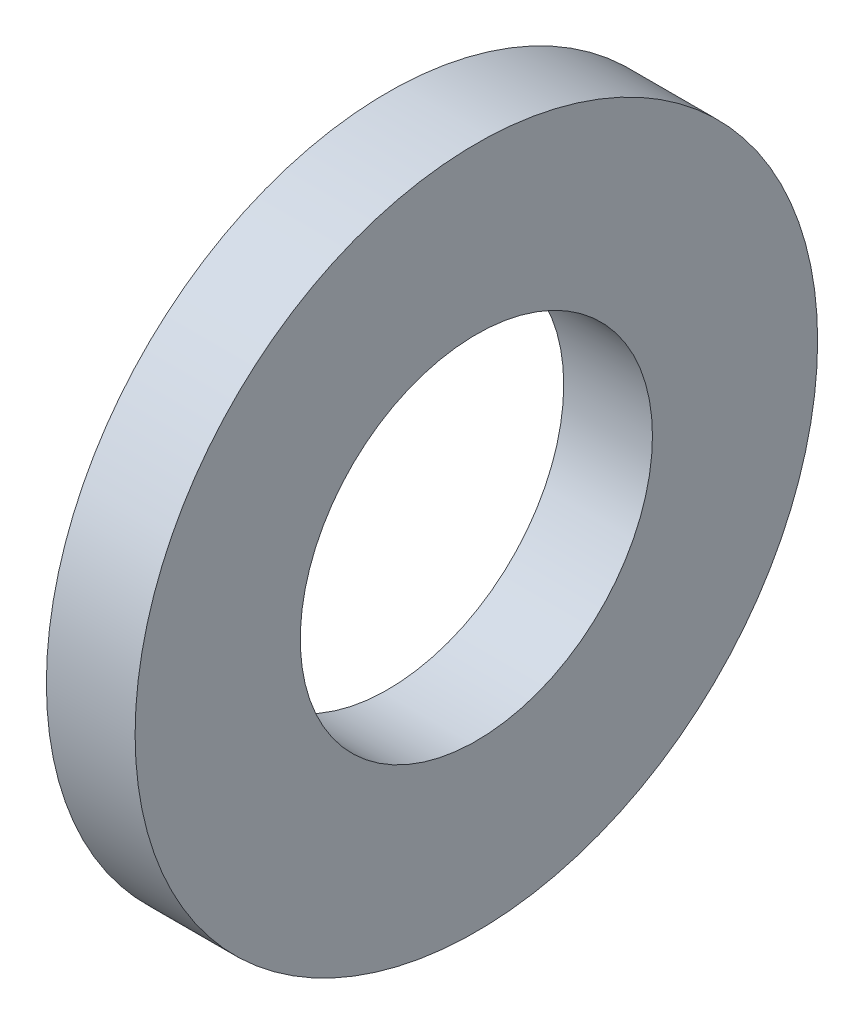
ISO-10303-21;
HEADER;
FILE_DESCRIPTION(('STEP AP214'),'2;1');
FILE_NAME('part.step','',(''),(''),'','','');
FILE_SCHEMA(('AUTOMOTIVE_DESIGN { 1 0 10303 214 1 1 1 1 }'));
ENDSEC;
DATA;
#1=APPLICATION_CONTEXT('core data for automotive mechanical design processes');
#2=APPLICATION_PROTOCOL_DEFINITION('international standard','automotive_design',2000,#1);
#3=PRODUCT_CONTEXT('',#1,'mechanical');
#4=PRODUCT('Part','Part','',(#3));
#5=PRODUCT_RELATED_PRODUCT_CATEGORY('part','',(#4));
#6=PRODUCT_DEFINITION_FORMATION('','',#4);
#7=PRODUCT_DEFINITION_CONTEXT('part definition',#1,'design');
#8=PRODUCT_DEFINITION('design','',#6,#7);
#9=PRODUCT_DEFINITION_SHAPE('','',#8);
#10=(LENGTH_UNIT() NAMED_UNIT(*) SI_UNIT(.MILLI.,.METRE.));
#11=(NAMED_UNIT(*) PLANE_ANGLE_UNIT() SI_UNIT($,.RADIAN.));
#12=(NAMED_UNIT(*) SI_UNIT($,.STERADIAN.) SOLID_ANGLE_UNIT());
#13=UNCERTAINTY_MEASURE_WITH_UNIT(LENGTH_MEASURE(1.E-05),#10,'distance_accuracy_value','');
#14=(GEOMETRIC_REPRESENTATION_CONTEXT(3) GLOBAL_UNCERTAINTY_ASSIGNED_CONTEXT((#13)) GLOBAL_UNIT_ASSIGNED_CONTEXT((#10,
#11,#12)) REPRESENTATION_CONTEXT('',''));
#15=CARTESIAN_POINT('',(0.,0.,0.));
#16=DIRECTION('',(0.,0.,1.));
#17=DIRECTION('',(1.,0.,0.));
#18=AXIS2_PLACEMENT_3D('',#15,#16,#17);
#19=CARTESIAN_POINT('',(1.651,0.,0.));
#20=DIRECTION('',(1.,0.,0.));
#21=DIRECTION('',(0.,0.,-1.));
#22=AXIS2_PLACEMENT_3D('',#19,#20,#21);
#23=PLANE('',#22);
#24=CARTESIAN_POINT('',(1.651,0.,0.));
#25=DIRECTION('',(1.,0.,0.));
#26=DIRECTION('',(0.,0.,-1.));
#27=AXIS2_PLACEMENT_3D('',#24,#25,#26);
#28=CIRCLE('',#27,3.2766);
#29=CARTESIAN_POINT('',(1.651,0.,-3.2766));
#30=VERTEX_POINT('',#29);
#31=EDGE_CURVE('E27',#30,#30,#28,.F.);
#32=ORIENTED_EDGE('',*,*,#31,.T.);
#33=EDGE_LOOP('',(#32));
#34=FACE_BOUND('',#33,.T.);
#35=CARTESIAN_POINT('',(1.651,0.,0.));
#36=DIRECTION('',(1.,0.,0.));
#37=DIRECTION('',(0.,0.,-1.));
#38=AXIS2_PLACEMENT_3D('',#35,#36,#37);
#39=CIRCLE('',#38,6.35);
#40=CARTESIAN_POINT('',(1.651,0.,-6.35));
#41=VERTEX_POINT('',#40);
#42=EDGE_CURVE('E18',#41,#41,#39,.F.);
#43=ORIENTED_EDGE('',*,*,#42,.F.);
#44=EDGE_LOOP('',(#43));
#45=FACE_BOUND('',#44,.T.);
#46=ADVANCED_FACE('F15',(#34,#45),#23,.T.);
#47=CARTESIAN_POINT('',(1.651,0.,0.));
#48=DIRECTION('',(1.,0.,0.));
#49=DIRECTION('',(0.,0.,-1.));
#50=AXIS2_PLACEMENT_3D('',#47,#48,#49);
#51=CYLINDRICAL_SURFACE('',#50,6.35);
#52=ORIENTED_EDGE('',*,*,#42,.T.);
#53=EDGE_LOOP('',(#52));
#54=FACE_BOUND('',#53,.T.);
#55=CARTESIAN_POINT('',(0.,0.,0.));
#56=DIRECTION('',(1.,0.,0.));
#57=DIRECTION('',(0.,0.,-1.));
#58=AXIS2_PLACEMENT_3D('',#55,#56,#57);
#59=CIRCLE('',#58,6.35);
#60=CARTESIAN_POINT('',(0.,0.,-6.35));
#61=VERTEX_POINT('',#60);
#62=EDGE_CURVE('E22',#61,#61,#59,.T.);
#63=ORIENTED_EDGE('',*,*,#62,.T.);
#64=EDGE_LOOP('',(#63));
#65=FACE_BOUND('',#64,.T.);
#66=ADVANCED_FACE('F35',(#54,#65),#51,.T.);
#67=CARTESIAN_POINT('',(1.651,0.,0.));
#68=DIRECTION('',(1.,0.,0.));
#69=DIRECTION('',(0.,0.,-1.));
#70=AXIS2_PLACEMENT_3D('',#67,#68,#69);
#71=CYLINDRICAL_SURFACE('',#70,3.2766);
#72=CARTESIAN_POINT('',(0.,0.,0.));
#73=DIRECTION('',(1.,0.,0.));
#74=DIRECTION('',(0.,0.,-1.));
#75=AXIS2_PLACEMENT_3D('',#72,#73,#74);
#76=CIRCLE('',#75,3.2766);
#77=CARTESIAN_POINT('',(0.,0.,-3.2766));
#78=VERTEX_POINT('',#77);
#79=EDGE_CURVE('E10',#78,#78,#76,.F.);
#80=ORIENTED_EDGE('',*,*,#79,.T.);
#81=EDGE_LOOP('',(#80));
#82=FACE_BOUND('',#81,.T.);
#83=ORIENTED_EDGE('',*,*,#31,.F.);
#84=EDGE_LOOP('',(#83));
#85=FACE_BOUND('',#84,.T.);
#86=ADVANCED_FACE('F43',(#82,#85),#71,.F.);
#87=CARTESIAN_POINT('',(0.,0.,0.));
#88=DIRECTION('',(1.,0.,0.));
#89=DIRECTION('',(0.,0.,-1.));
#90=AXIS2_PLACEMENT_3D('',#87,#88,#89);
#91=PLANE('',#90);
#92=ORIENTED_EDGE('',*,*,#79,.F.);
#93=EDGE_LOOP('',(#92));
#94=FACE_BOUND('',#93,.T.);
#95=ORIENTED_EDGE('',*,*,#62,.F.);
#96=EDGE_LOOP('',(#95));
#97=FACE_BOUND('',#96,.T.);
#98=ADVANCED_FACE('F44',(#94,#97),#91,.F.);
#99=CLOSED_SHELL('',(#46,#66,#86,#98));
#100=MANIFOLD_SOLID_BREP('B1',#99);
#101=ADVANCED_BREP_SHAPE_REPRESENTATION('',(#18,#100),#14);
#102=SHAPE_DEFINITION_REPRESENTATION(#9,#101);
ENDSEC;
END-ISO-10303-21;
